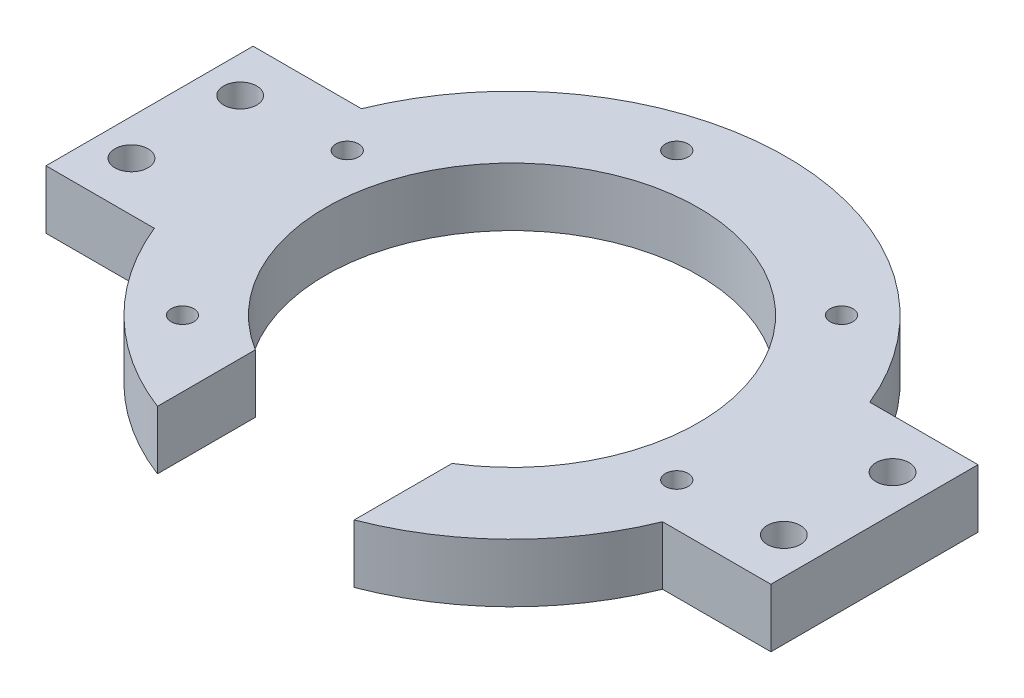
ISO-10303-21;
HEADER;
FILE_DESCRIPTION(('STEP AP214'),'2;1');
FILE_NAME('part.step','',(''),(''),'','','');
FILE_SCHEMA(('AUTOMOTIVE_DESIGN { 1 0 10303 214 1 1 1 1 }'));
ENDSEC;
DATA;
#1=APPLICATION_CONTEXT('core data for automotive mechanical design processes');
#2=APPLICATION_PROTOCOL_DEFINITION('international standard','automotive_design',2000,#1);
#3=PRODUCT_CONTEXT('',#1,'mechanical');
#4=PRODUCT('Part','Part','',(#3));
#5=PRODUCT_RELATED_PRODUCT_CATEGORY('part','',(#4));
#6=PRODUCT_DEFINITION_FORMATION('','',#4);
#7=PRODUCT_DEFINITION_CONTEXT('part definition',#1,'design');
#8=PRODUCT_DEFINITION('design','',#6,#7);
#9=PRODUCT_DEFINITION_SHAPE('','',#8);
#10=(LENGTH_UNIT() NAMED_UNIT(*) SI_UNIT(.MILLI.,.METRE.));
#11=(NAMED_UNIT(*) PLANE_ANGLE_UNIT() SI_UNIT($,.RADIAN.));
#12=(NAMED_UNIT(*) SI_UNIT($,.STERADIAN.) SOLID_ANGLE_UNIT());
#13=UNCERTAINTY_MEASURE_WITH_UNIT(LENGTH_MEASURE(1.E-05),#10,'distance_accuracy_value','');
#14=(GEOMETRIC_REPRESENTATION_CONTEXT(3) GLOBAL_UNCERTAINTY_ASSIGNED_CONTEXT((#13)) GLOBAL_UNIT_ASSIGNED_CONTEXT((#10,
#11,#12)) REPRESENTATION_CONTEXT('',''));
#15=CARTESIAN_POINT('',(0.,0.,0.));
#16=DIRECTION('',(0.,0.,1.));
#17=DIRECTION('',(1.,0.,0.));
#18=AXIS2_PLACEMENT_3D('',#15,#16,#17);
#19=CARTESIAN_POINT('',(0.,28.5928367151704,0.));
#20=DIRECTION('',(0.,1.,0.));
#21=DIRECTION('',(0.,0.,1.));
#22=AXIS2_PLACEMENT_3D('',#19,#20,#21);
#23=CYLINDRICAL_SURFACE('',#22,53.);
#24=CARTESIAN_POINT('',(0.,11.3,0.));
#25=DIRECTION('',(0.,1.,0.));
#26=DIRECTION('',(0.,0.,1.));
#27=AXIS2_PLACEMENT_3D('',#24,#25,#26);
#28=CIRCLE('',#27,53.);
#29=CARTESIAN_POINT('',(-49.0815647672321,11.3,20.));
#30=VERTEX_POINT('',#29);
#31=CARTESIAN_POINT('',(-19.,11.3,49.4772675074119));
#32=VERTEX_POINT('',#31);
#33=EDGE_CURVE('E67',#30,#32,#28,.T.);
#34=ORIENTED_EDGE('',*,*,#33,.F.);
#35=DIRECTION('',(0.,1.,0.));
#36=VECTOR('',#35,1.);
#37=CARTESIAN_POINT('',(-49.0815647672321,28.5928367151704,20.));
#38=LINE('',#37,#36);
#39=CARTESIAN_POINT('',(-49.0815647672321,0.,20.));
#40=VERTEX_POINT('',#39);
#41=EDGE_CURVE('E141',#30,#40,#38,.F.);
#42=ORIENTED_EDGE('',*,*,#41,.T.);
#43=CARTESIAN_POINT('',(0.,0.,0.));
#44=DIRECTION('',(0.,1.,0.));
#45=DIRECTION('',(0.,0.,1.));
#46=AXIS2_PLACEMENT_3D('',#43,#44,#45);
#47=CIRCLE('',#46,53.);
#48=CARTESIAN_POINT('',(-19.,0.,49.4772675074119));
#49=VERTEX_POINT('',#48);
#50=EDGE_CURVE('E293',#40,#49,#47,.T.);
#51=ORIENTED_EDGE('',*,*,#50,.T.);
#52=DIRECTION('',(0.,1.,0.));
#53=VECTOR('',#52,1.);
#54=CARTESIAN_POINT('',(-19.,28.5928367151704,49.4772675074119));
#55=LINE('',#54,#53);
#56=EDGE_CURVE('E278',#49,#32,#55,.T.);
#57=ORIENTED_EDGE('',*,*,#56,.T.);
#58=EDGE_LOOP('',(#34,#42,#51,#57));
#59=FACE_BOUND('',#58,.T.);
#60=ADVANCED_FACE('F43',(#59),#23,.T.);
#61=DIRECTION('',(0.,1.,0.));
#62=VECTOR('',#61,1.);
#63=CARTESIAN_POINT('',(49.0815647672321,28.5928367151704,20.));
#64=LINE('',#63,#62);
#65=CARTESIAN_POINT('',(49.0815647672321,11.3,20.));
#66=VERTEX_POINT('',#65);
#67=CARTESIAN_POINT('',(49.0815647672321,0.,20.));
#68=VERTEX_POINT('',#67);
#69=EDGE_CURVE('E216',#66,#68,#64,.F.);
#70=ORIENTED_EDGE('',*,*,#69,.F.);
#71=CARTESIAN_POINT('',(19.,11.3,49.4772675074119));
#72=VERTEX_POINT('',#71);
#73=EDGE_CURVE('E289',#72,#66,#28,.T.);
#74=ORIENTED_EDGE('',*,*,#73,.F.);
#75=DIRECTION('',(0.,1.,0.));
#76=VECTOR('',#75,1.);
#77=CARTESIAN_POINT('',(19.,28.5928367151704,49.4772675074119));
#78=LINE('',#77,#76);
#79=CARTESIAN_POINT('',(19.,0.,49.4772675074119));
#80=VERTEX_POINT('',#79);
#81=EDGE_CURVE('E264',#72,#80,#78,.F.);
#82=ORIENTED_EDGE('',*,*,#81,.T.);
#83=EDGE_CURVE('E295',#80,#68,#47,.T.);
#84=ORIENTED_EDGE('',*,*,#83,.T.);
#85=EDGE_LOOP('',(#70,#74,#82,#84));
#86=FACE_BOUND('',#85,.T.);
#87=ADVANCED_FACE('F379',(#86),#23,.T.);
#88=CARTESIAN_POINT('',(49.0815647672321,0.,-20.));
#89=VERTEX_POINT('',#88);
#90=CARTESIAN_POINT('',(-49.0815647672321,0.,-20.));
#91=VERTEX_POINT('',#90);
#92=EDGE_CURVE('E59',#89,#91,#47,.T.);
#93=ORIENTED_EDGE('',*,*,#92,.T.);
#94=DIRECTION('',(0.,1.,0.));
#95=VECTOR('',#94,1.);
#96=CARTESIAN_POINT('',(-49.0815647672321,28.5928367151704,-20.));
#97=LINE('',#96,#95);
#98=CARTESIAN_POINT('',(-49.0815647672321,11.3,-20.));
#99=VERTEX_POINT('',#98);
#100=EDGE_CURVE('E145',#91,#99,#97,.T.);
#101=ORIENTED_EDGE('',*,*,#100,.T.);
#102=CARTESIAN_POINT('',(49.0815647672321,11.3,-20.));
#103=VERTEX_POINT('',#102);
#104=EDGE_CURVE('E294',#103,#99,#28,.T.);
#105=ORIENTED_EDGE('',*,*,#104,.F.);
#106=DIRECTION('',(0.,1.,0.));
#107=VECTOR('',#106,1.);
#108=CARTESIAN_POINT('',(49.0815647672321,28.5928367151704,-20.));
#109=LINE('',#108,#107);
#110=EDGE_CURVE('E212',#89,#103,#109,.T.);
#111=ORIENTED_EDGE('',*,*,#110,.F.);
#112=EDGE_LOOP('',(#93,#101,#105,#111));
#113=FACE_BOUND('',#112,.T.);
#114=ADVANCED_FACE('F392',(#113),#23,.T.);
#115=CARTESIAN_POINT('',(0.,0.,0.));
#116=DIRECTION('',(0.,1.,0.));
#117=DIRECTION('',(0.,0.,1.));
#118=AXIS2_PLACEMENT_3D('',#115,#116,#117);
#119=PLANE('',#118);
#120=CARTESIAN_POINT('',(-63.,0.,10.5));
#121=DIRECTION('',(0.,1.,0.));
#122=DIRECTION('',(0.,0.,-1.));
#123=AXIS2_PLACEMENT_3D('',#120,#121,#122);
#124=CIRCLE('',#123,3.2);
#125=CARTESIAN_POINT('',(-63.,0.,7.3));
#126=VERTEX_POINT('',#125);
#127=EDGE_CURVE('E412',#126,#126,#124,.T.);
#128=ORIENTED_EDGE('',*,*,#127,.T.);
#129=EDGE_LOOP('',(#128));
#130=FACE_BOUND('',#129,.T.);
#131=CARTESIAN_POINT('',(-63.,0.,-10.5));
#132=DIRECTION('',(0.,-1.,0.));
#133=DIRECTION('',(0.,0.,1.));
#134=AXIS2_PLACEMENT_3D('',#131,#132,#133);
#135=CIRCLE('',#134,3.2);
#136=CARTESIAN_POINT('',(-63.,0.,-7.3));
#137=VERTEX_POINT('',#136);
#138=EDGE_CURVE('E416',#137,#137,#135,.T.);
#139=ORIENTED_EDGE('',*,*,#138,.F.);
#140=EDGE_LOOP('',(#139));
#141=FACE_BOUND('',#140,.T.);
#142=CARTESIAN_POINT('',(63.,0.,10.5));
#143=DIRECTION('',(0.,-1.,0.));
#144=DIRECTION('',(0.,0.,-1.));
#145=AXIS2_PLACEMENT_3D('',#142,#143,#144);
#146=CIRCLE('',#145,3.2);
#147=CARTESIAN_POINT('',(63.,0.,7.3));
#148=VERTEX_POINT('',#147);
#149=EDGE_CURVE('E420',#148,#148,#146,.T.);
#150=ORIENTED_EDGE('',*,*,#149,.F.);
#151=EDGE_LOOP('',(#150));
#152=FACE_BOUND('',#151,.T.);
#153=CARTESIAN_POINT('',(63.,0.,-10.5));
#154=DIRECTION('',(0.,1.,0.));
#155=DIRECTION('',(0.,0.,1.));
#156=AXIS2_PLACEMENT_3D('',#153,#154,#155);
#157=CIRCLE('',#156,3.2);
#158=CARTESIAN_POINT('',(63.,0.,-7.3));
#159=VERTEX_POINT('',#158);
#160=EDGE_CURVE('E157',#159,#159,#157,.T.);
#161=ORIENTED_EDGE('',*,*,#160,.T.);
#162=EDGE_LOOP('',(#161));
#163=FACE_BOUND('',#162,.T.);
#164=ORIENTED_EDGE('',*,*,#50,.F.);
#165=DIRECTION('',(1.,0.,0.));
#166=VECTOR('',#165,1.);
#167=CARTESIAN_POINT('',(-70.,0.,20.));
#168=LINE('',#167,#166);
#169=CARTESIAN_POINT('',(-70.,0.,20.));
#170=VERTEX_POINT('',#169);
#171=EDGE_CURVE('E173',#170,#40,#168,.T.);
#172=ORIENTED_EDGE('',*,*,#171,.F.);
#173=DIRECTION('',(0.,0.,-1.));
#174=VECTOR('',#173,1.);
#175=CARTESIAN_POINT('',(-70.,0.,20.));
#176=LINE('',#175,#174);
#177=CARTESIAN_POINT('',(-70.,0.,-20.));
#178=VERTEX_POINT('',#177);
#179=EDGE_CURVE('E155',#170,#178,#176,.T.);
#180=ORIENTED_EDGE('',*,*,#179,.T.);
#181=DIRECTION('',(1.,0.,0.));
#182=VECTOR('',#181,1.);
#183=CARTESIAN_POINT('',(-70.,0.,-20.));
#184=LINE('',#183,#182);
#185=EDGE_CURVE('E176',#178,#91,#184,.T.);
#186=ORIENTED_EDGE('',*,*,#185,.T.);
#187=ORIENTED_EDGE('',*,*,#92,.F.);
#188=DIRECTION('',(-1.,0.,0.));
#189=VECTOR('',#188,1.);
#190=CARTESIAN_POINT('',(70.,0.,-20.));
#191=LINE('',#190,#189);
#192=CARTESIAN_POINT('',(70.,0.,-20.));
#193=VERTEX_POINT('',#192);
#194=EDGE_CURVE('E205',#193,#89,#191,.T.);
#195=ORIENTED_EDGE('',*,*,#194,.F.);
#196=DIRECTION('',(0.,0.,-1.));
#197=VECTOR('',#196,1.);
#198=CARTESIAN_POINT('',(70.,0.,20.));
#199=LINE('',#198,#197);
#200=CARTESIAN_POINT('',(70.,0.,20.));
#201=VERTEX_POINT('',#200);
#202=EDGE_CURVE('E190',#201,#193,#199,.T.);
#203=ORIENTED_EDGE('',*,*,#202,.F.);
#204=DIRECTION('',(-1.,0.,0.));
#205=VECTOR('',#204,1.);
#206=CARTESIAN_POINT('',(70.,0.,20.));
#207=LINE('',#206,#205);
#208=EDGE_CURVE('E208',#201,#68,#207,.T.);
#209=ORIENTED_EDGE('',*,*,#208,.T.);
#210=ORIENTED_EDGE('',*,*,#83,.F.);
#211=DIRECTION('',(0.,0.,1.));
#212=VECTOR('',#211,1.);
#213=CARTESIAN_POINT('',(19.,0.,11.7));
#214=LINE('',#213,#212);
#215=CARTESIAN_POINT('',(19.,0.,30.5777697028413));
#216=VERTEX_POINT('',#215);
#217=EDGE_CURVE('E269',#216,#80,#214,.T.);
#218=ORIENTED_EDGE('',*,*,#217,.F.);
#219=CARTESIAN_POINT('',(0.,0.,0.));
#220=DIRECTION('',(0.,1.,0.));
#221=DIRECTION('',(0.,0.,1.));
#222=AXIS2_PLACEMENT_3D('',#219,#220,#221);
#223=CIRCLE('',#222,36.);
#224=CARTESIAN_POINT('',(-19.,0.,30.5777697028413));
#225=VERTEX_POINT('',#224);
#226=EDGE_CURVE('E282',#216,#225,#223,.T.);
#227=ORIENTED_EDGE('',*,*,#226,.T.);
#228=DIRECTION('',(0.,0.,1.));
#229=VECTOR('',#228,1.);
#230=CARTESIAN_POINT('',(-19.,0.,11.7));
#231=LINE('',#230,#229);
#232=EDGE_CURVE('E256',#225,#49,#231,.T.);
#233=ORIENTED_EDGE('',*,*,#232,.T.);
#234=EDGE_LOOP('',(#164,#172,#180,#186,#187,#195,#203,#209,#210,#218,#227,#233));
#235=FACE_BOUND('',#234,.T.);
#236=CARTESIAN_POINT('',(-11.6468570296132,0.,-43.4666621830081));
#237=DIRECTION('',(0.,1.,0.));
#238=DIRECTION('',(0.,0.,1.));
#239=AXIS2_PLACEMENT_3D('',#236,#237,#238);
#240=CIRCLE('',#239,2.2);
#241=CARTESIAN_POINT('',(-11.6468570296132,0.,-41.2666621830081));
#242=VERTEX_POINT('',#241);
#243=EDGE_CURVE('E224',#242,#242,#240,.T.);
#244=ORIENTED_EDGE('',*,*,#243,.T.);
#245=EDGE_LOOP('',(#244));
#246=FACE_BOUND('',#245,.T.);
#247=CARTESIAN_POINT('',(-31.8198051533951,0.,31.8198051533941));
#248=DIRECTION('',(0.,1.,0.));
#249=DIRECTION('',(0.866025403784443,0.,-0.499999999999992));
#250=AXIS2_PLACEMENT_3D('',#247,#248,#249);
#251=CIRCLE('',#250,2.2);
#252=CARTESIAN_POINT('',(-29.9145492650693,0.,30.7198051533941));
#253=VERTEX_POINT('',#252);
#254=EDGE_CURVE('E245',#253,#253,#251,.T.);
#255=ORIENTED_EDGE('',*,*,#254,.T.);
#256=EDGE_LOOP('',(#255));
#257=FACE_BOUND('',#256,.T.);
#258=CARTESIAN_POINT('',(31.8198051533951,0.,-31.8198051533941));
#259=DIRECTION('',(0.,1.,0.));
#260=DIRECTION('',(0.866025403784443,0.,-0.499999999999992));
#261=AXIS2_PLACEMENT_3D('',#258,#259,#260);
#262=CIRCLE('',#261,2.2);
#263=CARTESIAN_POINT('',(33.7250610417209,0.,-32.9198051533941));
#264=VERTEX_POINT('',#263);
#265=EDGE_CURVE('E237',#264,#264,#262,.T.);
#266=ORIENTED_EDGE('',*,*,#265,.T.);
#267=EDGE_LOOP('',(#266));
#268=FACE_BOUND('',#267,.T.);
#269=CARTESIAN_POINT('',(43.4666621830079,0.,11.6468570296139));
#270=DIRECTION('',(0.,1.,0.));
#271=DIRECTION('',(-0.866025403784436,0.,-0.500000000000004));
#272=AXIS2_PLACEMENT_3D('',#269,#270,#271);
#273=CIRCLE('',#272,2.2);
#274=CARTESIAN_POINT('',(41.5614062946822,0.,10.5468570296139));
#275=VERTEX_POINT('',#274);
#276=EDGE_CURVE('E229',#275,#275,#273,.T.);
#277=ORIENTED_EDGE('',*,*,#276,.T.);
#278=EDGE_LOOP('',(#277));
#279=FACE_BOUND('',#278,.T.);
#280=CARTESIAN_POINT('',(-43.4666621830079,0.,-11.6468570296139));
#281=DIRECTION('',(0.,1.,0.));
#282=DIRECTION('',(-0.866025403784436,0.,-0.500000000000004));
#283=AXIS2_PLACEMENT_3D('',#280,#281,#282);
#284=CIRCLE('',#283,2.2);
#285=CARTESIAN_POINT('',(-45.3719180713337,0.,-12.7468570296139));
#286=VERTEX_POINT('',#285);
#287=EDGE_CURVE('E220',#286,#286,#284,.T.);
#288=ORIENTED_EDGE('',*,*,#287,.T.);
#289=EDGE_LOOP('',(#288));
#290=FACE_BOUND('',#289,.T.);
#291=ADVANCED_FACE('F45',(#130,#141,#152,#163,#235,#246,#257,#268,#279,#290),#119,.F.);
#292=CARTESIAN_POINT('',(0.,11.3,-53.));
#293=DIRECTION('',(0.,-1.,0.));
#294=DIRECTION('',(0.,0.,-1.));
#295=AXIS2_PLACEMENT_3D('',#292,#293,#294);
#296=PLANE('',#295);
#297=CARTESIAN_POINT('',(-63.,11.3,10.5));
#298=DIRECTION('',(0.,1.,0.));
#299=DIRECTION('',(0.,0.,-1.));
#300=AXIS2_PLACEMENT_3D('',#297,#298,#299);
#301=CIRCLE('',#300,3.2);
#302=CARTESIAN_POINT('',(-63.,11.3,7.3));
#303=VERTEX_POINT('',#302);
#304=EDGE_CURVE('E443',#303,#303,#301,.T.);
#305=ORIENTED_EDGE('',*,*,#304,.F.);
#306=EDGE_LOOP('',(#305));
#307=FACE_BOUND('',#306,.T.);
#308=CARTESIAN_POINT('',(-63.,11.3,-10.5));
#309=DIRECTION('',(0.,-1.,0.));
#310=DIRECTION('',(0.,0.,1.));
#311=AXIS2_PLACEMENT_3D('',#308,#309,#310);
#312=CIRCLE('',#311,3.2);
#313=CARTESIAN_POINT('',(-63.,11.3,-7.3));
#314=VERTEX_POINT('',#313);
#315=EDGE_CURVE('E437',#314,#314,#312,.T.);
#316=ORIENTED_EDGE('',*,*,#315,.T.);
#317=EDGE_LOOP('',(#316));
#318=FACE_BOUND('',#317,.T.);
#319=CARTESIAN_POINT('',(63.,11.3,10.5));
#320=DIRECTION('',(0.,-1.,0.));
#321=DIRECTION('',(0.,0.,-1.));
#322=AXIS2_PLACEMENT_3D('',#319,#320,#321);
#323=CIRCLE('',#322,3.2);
#324=CARTESIAN_POINT('',(63.,11.3,7.3));
#325=VERTEX_POINT('',#324);
#326=EDGE_CURVE('E431',#325,#325,#323,.T.);
#327=ORIENTED_EDGE('',*,*,#326,.T.);
#328=EDGE_LOOP('',(#327));
#329=FACE_BOUND('',#328,.T.);
#330=CARTESIAN_POINT('',(63.,11.3,-10.5));
#331=DIRECTION('',(0.,1.,0.));
#332=DIRECTION('',(0.,0.,1.));
#333=AXIS2_PLACEMENT_3D('',#330,#331,#332);
#334=CIRCLE('',#333,3.2);
#335=CARTESIAN_POINT('',(63.,11.3,-7.3));
#336=VERTEX_POINT('',#335);
#337=EDGE_CURVE('E425',#336,#336,#334,.T.);
#338=ORIENTED_EDGE('',*,*,#337,.F.);
#339=EDGE_LOOP('',(#338));
#340=FACE_BOUND('',#339,.T.);
#341=ORIENTED_EDGE('',*,*,#104,.T.);
#342=DIRECTION('',(1.,0.,0.));
#343=VECTOR('',#342,1.);
#344=CARTESIAN_POINT('',(-70.,11.3,-20.));
#345=LINE('',#344,#343);
#346=CARTESIAN_POINT('',(-70.,11.3,-20.));
#347=VERTEX_POINT('',#346);
#348=EDGE_CURVE('E146',#347,#99,#345,.T.);
#349=ORIENTED_EDGE('',*,*,#348,.F.);
#350=DIRECTION('',(0.,0.,1.));
#351=VECTOR('',#350,1.);
#352=CARTESIAN_POINT('',(-70.,11.3,20.));
#353=LINE('',#352,#351);
#354=CARTESIAN_POINT('',(-70.,11.3,20.));
#355=VERTEX_POINT('',#354);
#356=EDGE_CURVE('E152',#347,#355,#353,.T.);
#357=ORIENTED_EDGE('',*,*,#356,.T.);
#358=DIRECTION('',(1.,0.,0.));
#359=VECTOR('',#358,1.);
#360=CARTESIAN_POINT('',(-70.,11.3,20.));
#361=LINE('',#360,#359);
#362=EDGE_CURVE('E135',#355,#30,#361,.T.);
#363=ORIENTED_EDGE('',*,*,#362,.T.);
#364=ORIENTED_EDGE('',*,*,#33,.T.);
#365=DIRECTION('',(0.,0.,1.));
#366=VECTOR('',#365,1.);
#367=CARTESIAN_POINT('',(-19.,11.3,11.7));
#368=LINE('',#367,#366);
#369=CARTESIAN_POINT('',(-19.,11.3,30.5777697028413));
#370=VERTEX_POINT('',#369);
#371=EDGE_CURVE('E260',#370,#32,#368,.T.);
#372=ORIENTED_EDGE('',*,*,#371,.F.);
#373=CARTESIAN_POINT('',(0.,11.3,0.));
#374=DIRECTION('',(0.,1.,0.));
#375=DIRECTION('',(0.,0.,1.));
#376=AXIS2_PLACEMENT_3D('',#373,#374,#375);
#377=CIRCLE('',#376,36.);
#378=CARTESIAN_POINT('',(19.,11.3,30.5777697028413));
#379=VERTEX_POINT('',#378);
#380=EDGE_CURVE('E281',#379,#370,#377,.T.);
#381=ORIENTED_EDGE('',*,*,#380,.F.);
#382=DIRECTION('',(0.,0.,1.));
#383=VECTOR('',#382,1.);
#384=CARTESIAN_POINT('',(19.,11.3,11.7));
#385=LINE('',#384,#383);
#386=EDGE_CURVE('E265',#379,#72,#385,.T.);
#387=ORIENTED_EDGE('',*,*,#386,.T.);
#388=ORIENTED_EDGE('',*,*,#73,.T.);
#389=DIRECTION('',(-1.,0.,0.));
#390=VECTOR('',#389,1.);
#391=CARTESIAN_POINT('',(70.,11.3,20.));
#392=LINE('',#391,#390);
#393=CARTESIAN_POINT('',(70.,11.3,20.));
#394=VERTEX_POINT('',#393);
#395=EDGE_CURVE('E199',#394,#66,#392,.T.);
#396=ORIENTED_EDGE('',*,*,#395,.F.);
#397=DIRECTION('',(0.,0.,1.));
#398=VECTOR('',#397,1.);
#399=CARTESIAN_POINT('',(70.,11.3,20.));
#400=LINE('',#399,#398);
#401=CARTESIAN_POINT('',(70.,11.3,-20.));
#402=VERTEX_POINT('',#401);
#403=EDGE_CURVE('E196',#402,#394,#400,.T.);
#404=ORIENTED_EDGE('',*,*,#403,.F.);
#405=DIRECTION('',(-1.,0.,0.));
#406=VECTOR('',#405,1.);
#407=CARTESIAN_POINT('',(70.,11.3,-20.));
#408=LINE('',#407,#406);
#409=EDGE_CURVE('E202',#402,#103,#408,.T.);
#410=ORIENTED_EDGE('',*,*,#409,.T.);
#411=EDGE_LOOP('',(#341,#349,#357,#363,#364,#372,#381,#387,#388,#396,#404,#410));
#412=FACE_BOUND('',#411,.T.);
#413=CARTESIAN_POINT('',(-11.6468570296132,11.3,-43.4666621830081));
#414=DIRECTION('',(0.,1.,0.));
#415=DIRECTION('',(0.,0.,1.));
#416=AXIS2_PLACEMENT_3D('',#413,#414,#415);
#417=CIRCLE('',#416,2.2);
#418=CARTESIAN_POINT('',(-11.6468570296132,11.3,-41.2666621830081));
#419=VERTEX_POINT('',#418);
#420=EDGE_CURVE('E252',#419,#419,#417,.T.);
#421=ORIENTED_EDGE('',*,*,#420,.F.);
#422=EDGE_LOOP('',(#421));
#423=FACE_BOUND('',#422,.T.);
#424=CARTESIAN_POINT('',(-31.8198051533951,11.3,31.8198051533941));
#425=DIRECTION('',(0.,1.,0.));
#426=DIRECTION('',(0.866025403784443,0.,-0.499999999999992));
#427=AXIS2_PLACEMENT_3D('',#424,#425,#426);
#428=CIRCLE('',#427,2.2);
#429=CARTESIAN_POINT('',(-29.9145492650693,11.3,30.7198051533941));
#430=VERTEX_POINT('',#429);
#431=EDGE_CURVE('E219',#430,#430,#428,.T.);
#432=ORIENTED_EDGE('',*,*,#431,.F.);
#433=EDGE_LOOP('',(#432));
#434=FACE_BOUND('',#433,.T.);
#435=CARTESIAN_POINT('',(31.8198051533951,11.3,-31.8198051533941));
#436=DIRECTION('',(0.,1.,0.));
#437=DIRECTION('',(0.866025403784443,0.,-0.499999999999992));
#438=AXIS2_PLACEMENT_3D('',#435,#436,#437);
#439=CIRCLE('',#438,2.2);
#440=CARTESIAN_POINT('',(33.7250610417209,11.3,-32.9198051533941));
#441=VERTEX_POINT('',#440);
#442=EDGE_CURVE('E241',#441,#441,#439,.T.);
#443=ORIENTED_EDGE('',*,*,#442,.F.);
#444=EDGE_LOOP('',(#443));
#445=FACE_BOUND('',#444,.T.);
#446=CARTESIAN_POINT('',(43.4666621830079,11.3,11.6468570296139));
#447=DIRECTION('',(0.,1.,0.));
#448=DIRECTION('',(-0.866025403784436,0.,-0.500000000000004));
#449=AXIS2_PLACEMENT_3D('',#446,#447,#448);
#450=CIRCLE('',#449,2.2);
#451=CARTESIAN_POINT('',(41.5614062946822,11.3,10.5468570296139));
#452=VERTEX_POINT('',#451);
#453=EDGE_CURVE('E233',#452,#452,#450,.T.);
#454=ORIENTED_EDGE('',*,*,#453,.F.);
#455=EDGE_LOOP('',(#454));
#456=FACE_BOUND('',#455,.T.);
#457=CARTESIAN_POINT('',(-43.4666621830079,11.3,-11.6468570296139));
#458=DIRECTION('',(0.,1.,0.));
#459=DIRECTION('',(-0.866025403784436,0.,-0.500000000000004));
#460=AXIS2_PLACEMENT_3D('',#457,#458,#459);
#461=CIRCLE('',#460,2.2);
#462=CARTESIAN_POINT('',(-45.3719180713337,11.3,-12.7468570296139));
#463=VERTEX_POINT('',#462);
#464=EDGE_CURVE('E225',#463,#463,#461,.T.);
#465=ORIENTED_EDGE('',*,*,#464,.F.);
#466=EDGE_LOOP('',(#465));
#467=FACE_BOUND('',#466,.T.);
#468=ADVANCED_FACE('F160',(#307,#318,#329,#340,#412,#423,#434,#445,#456,#467),#296,.F.);
#469=CARTESIAN_POINT('',(0.,0.,0.));
#470=DIRECTION('',(0.,1.,0.));
#471=DIRECTION('',(0.,0.,1.));
#472=AXIS2_PLACEMENT_3D('',#469,#470,#471);
#473=CYLINDRICAL_SURFACE('',#472,36.);
#474=ORIENTED_EDGE('',*,*,#380,.T.);
#475=DIRECTION('',(0.,1.,0.));
#476=VECTOR('',#475,1.);
#477=CARTESIAN_POINT('',(-19.,0.,30.5777697028413));
#478=LINE('',#477,#476);
#479=EDGE_CURVE('E11',#370,#225,#478,.F.);
#480=ORIENTED_EDGE('',*,*,#479,.T.);
#481=ORIENTED_EDGE('',*,*,#226,.F.);
#482=DIRECTION('',(0.,1.,0.));
#483=VECTOR('',#482,1.);
#484=CARTESIAN_POINT('',(19.,0.,30.5777697028413));
#485=LINE('',#484,#483);
#486=EDGE_CURVE('E52',#216,#379,#485,.T.);
#487=ORIENTED_EDGE('',*,*,#486,.T.);
#488=EDGE_LOOP('',(#474,#480,#481,#487));
#489=FACE_BOUND('',#488,.T.);
#490=ADVANCED_FACE('F304',(#489),#473,.F.);
#491=CARTESIAN_POINT('',(19.,11.3,11.7));
#492=DIRECTION('',(1.,0.,0.));
#493=DIRECTION('',(0.,1.,0.));
#494=AXIS2_PLACEMENT_3D('',#491,#492,#493);
#495=PLANE('',#494);
#496=ORIENTED_EDGE('',*,*,#386,.F.);
#497=ORIENTED_EDGE('',*,*,#486,.F.);
#498=ORIENTED_EDGE('',*,*,#217,.T.);
#499=ORIENTED_EDGE('',*,*,#81,.F.);
#500=EDGE_LOOP('',(#496,#497,#498,#499));
#501=FACE_BOUND('',#500,.T.);
#502=ADVANCED_FACE('F380',(#501),#495,.F.);
#503=CARTESIAN_POINT('',(-19.,11.3,11.7));
#504=DIRECTION('',(-1.,0.,0.));
#505=DIRECTION('',(0.,-1.,0.));
#506=AXIS2_PLACEMENT_3D('',#503,#504,#505);
#507=PLANE('',#506);
#508=ORIENTED_EDGE('',*,*,#232,.F.);
#509=ORIENTED_EDGE('',*,*,#479,.F.);
#510=ORIENTED_EDGE('',*,*,#371,.T.);
#511=ORIENTED_EDGE('',*,*,#56,.F.);
#512=EDGE_LOOP('',(#508,#509,#510,#511));
#513=FACE_BOUND('',#512,.T.);
#514=ADVANCED_FACE('F311',(#513),#507,.F.);
#515=CARTESIAN_POINT('',(-11.6468570296132,0.,-43.4666621830081));
#516=DIRECTION('',(0.,1.,0.));
#517=DIRECTION('',(0.,0.,1.));
#518=AXIS2_PLACEMENT_3D('',#515,#516,#517);
#519=CYLINDRICAL_SURFACE('',#518,2.2);
#520=ORIENTED_EDGE('',*,*,#243,.F.);
#521=EDGE_LOOP('',(#520));
#522=FACE_BOUND('',#521,.T.);
#523=ORIENTED_EDGE('',*,*,#420,.T.);
#524=EDGE_LOOP('',(#523));
#525=FACE_BOUND('',#524,.T.);
#526=ADVANCED_FACE('F387',(#522,#525),#519,.F.);
#527=CARTESIAN_POINT('',(-31.8198051533951,0.,31.8198051533941));
#528=DIRECTION('',(0.,1.,0.));
#529=DIRECTION('',(0.,0.,1.));
#530=AXIS2_PLACEMENT_3D('',#527,#528,#529);
#531=CYLINDRICAL_SURFACE('',#530,2.2);
#532=ORIENTED_EDGE('',*,*,#254,.F.);
#533=EDGE_LOOP('',(#532));
#534=FACE_BOUND('',#533,.T.);
#535=ORIENTED_EDGE('',*,*,#431,.T.);
#536=EDGE_LOOP('',(#535));
#537=FACE_BOUND('',#536,.T.);
#538=ADVANCED_FACE('F497',(#534,#537),#531,.F.);
#539=CARTESIAN_POINT('',(31.8198051533951,0.,-31.8198051533941));
#540=DIRECTION('',(0.,1.,0.));
#541=DIRECTION('',(0.,0.,1.));
#542=AXIS2_PLACEMENT_3D('',#539,#540,#541);
#543=CYLINDRICAL_SURFACE('',#542,2.2);
#544=ORIENTED_EDGE('',*,*,#265,.F.);
#545=EDGE_LOOP('',(#544));
#546=FACE_BOUND('',#545,.T.);
#547=ORIENTED_EDGE('',*,*,#442,.T.);
#548=EDGE_LOOP('',(#547));
#549=FACE_BOUND('',#548,.T.);
#550=ADVANCED_FACE('F493',(#546,#549),#543,.F.);
#551=CARTESIAN_POINT('',(43.4666621830079,0.,11.6468570296139));
#552=DIRECTION('',(0.,1.,0.));
#553=DIRECTION('',(0.,0.,1.));
#554=AXIS2_PLACEMENT_3D('',#551,#552,#553);
#555=CYLINDRICAL_SURFACE('',#554,2.2);
#556=ORIENTED_EDGE('',*,*,#276,.F.);
#557=EDGE_LOOP('',(#556));
#558=FACE_BOUND('',#557,.T.);
#559=ORIENTED_EDGE('',*,*,#453,.T.);
#560=EDGE_LOOP('',(#559));
#561=FACE_BOUND('',#560,.T.);
#562=ADVANCED_FACE('F489',(#558,#561),#555,.F.);
#563=CARTESIAN_POINT('',(-43.4666621830079,0.,-11.6468570296139));
#564=DIRECTION('',(0.,1.,0.));
#565=DIRECTION('',(0.,0.,1.));
#566=AXIS2_PLACEMENT_3D('',#563,#564,#565);
#567=CYLINDRICAL_SURFACE('',#566,2.2);
#568=ORIENTED_EDGE('',*,*,#287,.F.);
#569=EDGE_LOOP('',(#568));
#570=FACE_BOUND('',#569,.T.);
#571=ORIENTED_EDGE('',*,*,#464,.T.);
#572=EDGE_LOOP('',(#571));
#573=FACE_BOUND('',#572,.T.);
#574=ADVANCED_FACE('F486',(#570,#573),#567,.F.);
#575=CARTESIAN_POINT('',(70.,0.,20.));
#576=DIRECTION('',(0.,0.,-1.));
#577=DIRECTION('',(-1.,0.,0.));
#578=AXIS2_PLACEMENT_3D('',#575,#576,#577);
#579=PLANE('',#578);
#580=ORIENTED_EDGE('',*,*,#395,.T.);
#581=ORIENTED_EDGE('',*,*,#69,.T.);
#582=ORIENTED_EDGE('',*,*,#208,.F.);
#583=DIRECTION('',(0.,-1.,0.));
#584=VECTOR('',#583,1.);
#585=CARTESIAN_POINT('',(70.,0.,20.));
#586=LINE('',#585,#584);
#587=EDGE_CURVE('E186',#394,#201,#586,.T.);
#588=ORIENTED_EDGE('',*,*,#587,.F.);
#589=EDGE_LOOP('',(#580,#581,#582,#588));
#590=FACE_BOUND('',#589,.T.);
#591=ADVANCED_FACE('F375',(#590),#579,.F.);
#592=CARTESIAN_POINT('',(70.,0.,-20.));
#593=DIRECTION('',(0.,0.,1.));
#594=DIRECTION('',(0.,-1.,0.));
#595=AXIS2_PLACEMENT_3D('',#592,#593,#594);
#596=PLANE('',#595);
#597=ORIENTED_EDGE('',*,*,#194,.T.);
#598=ORIENTED_EDGE('',*,*,#110,.T.);
#599=ORIENTED_EDGE('',*,*,#409,.F.);
#600=DIRECTION('',(0.,1.,0.));
#601=VECTOR('',#600,1.);
#602=CARTESIAN_POINT('',(70.,0.,-20.));
#603=LINE('',#602,#601);
#604=EDGE_CURVE('E193',#193,#402,#603,.T.);
#605=ORIENTED_EDGE('',*,*,#604,.F.);
#606=EDGE_LOOP('',(#597,#598,#599,#605));
#607=FACE_BOUND('',#606,.T.);
#608=ADVANCED_FACE('F368',(#607),#596,.F.);
#609=CARTESIAN_POINT('',(70.,0.,0.));
#610=DIRECTION('',(-1.,0.,0.));
#611=DIRECTION('',(0.,0.,1.));
#612=AXIS2_PLACEMENT_3D('',#609,#610,#611);
#613=PLANE('',#612);
#614=ORIENTED_EDGE('',*,*,#587,.T.);
#615=ORIENTED_EDGE('',*,*,#202,.T.);
#616=ORIENTED_EDGE('',*,*,#604,.T.);
#617=ORIENTED_EDGE('',*,*,#403,.T.);
#618=EDGE_LOOP('',(#614,#615,#616,#617));
#619=FACE_BOUND('',#618,.T.);
#620=ADVANCED_FACE('F370',(#619),#613,.F.);
#621=CARTESIAN_POINT('',(-70.,0.,20.));
#622=DIRECTION('',(0.,0.,1.));
#623=DIRECTION('',(1.,0.,0.));
#624=AXIS2_PLACEMENT_3D('',#621,#622,#623);
#625=PLANE('',#624);
#626=ORIENTED_EDGE('',*,*,#41,.F.);
#627=ORIENTED_EDGE('',*,*,#362,.F.);
#628=DIRECTION('',(0.,-1.,0.));
#629=VECTOR('',#628,1.);
#630=CARTESIAN_POINT('',(-70.,0.,20.));
#631=LINE('',#630,#629);
#632=EDGE_CURVE('E139',#355,#170,#631,.T.);
#633=ORIENTED_EDGE('',*,*,#632,.T.);
#634=ORIENTED_EDGE('',*,*,#171,.T.);
#635=EDGE_LOOP('',(#626,#627,#633,#634));
#636=FACE_BOUND('',#635,.T.);
#637=ADVANCED_FACE('F137',(#636),#625,.T.);
#638=CARTESIAN_POINT('',(-70.,0.,-20.));
#639=DIRECTION('',(0.,0.,-1.));
#640=DIRECTION('',(0.,1.,0.));
#641=AXIS2_PLACEMENT_3D('',#638,#639,#640);
#642=PLANE('',#641);
#643=ORIENTED_EDGE('',*,*,#100,.F.);
#644=ORIENTED_EDGE('',*,*,#185,.F.);
#645=DIRECTION('',(0.,1.,0.));
#646=VECTOR('',#645,1.);
#647=CARTESIAN_POINT('',(-70.,0.,-20.));
#648=LINE('',#647,#646);
#649=EDGE_CURVE('E164',#178,#347,#648,.T.);
#650=ORIENTED_EDGE('',*,*,#649,.T.);
#651=ORIENTED_EDGE('',*,*,#348,.T.);
#652=EDGE_LOOP('',(#643,#644,#650,#651));
#653=FACE_BOUND('',#652,.T.);
#654=ADVANCED_FACE('F363',(#653),#642,.T.);
#655=CARTESIAN_POINT('',(-70.,0.,0.));
#656=DIRECTION('',(1.,0.,0.));
#657=DIRECTION('',(0.,0.,1.));
#658=AXIS2_PLACEMENT_3D('',#655,#656,#657);
#659=PLANE('',#658);
#660=ORIENTED_EDGE('',*,*,#632,.F.);
#661=ORIENTED_EDGE('',*,*,#356,.F.);
#662=ORIENTED_EDGE('',*,*,#649,.F.);
#663=ORIENTED_EDGE('',*,*,#179,.F.);
#664=EDGE_LOOP('',(#660,#661,#662,#663));
#665=FACE_BOUND('',#664,.T.);
#666=ADVANCED_FACE('F150',(#665),#659,.F.);
#667=CARTESIAN_POINT('',(63.,0.,-10.5));
#668=DIRECTION('',(0.,1.,0.));
#669=DIRECTION('',(0.,0.,1.));
#670=AXIS2_PLACEMENT_3D('',#667,#668,#669);
#671=CYLINDRICAL_SURFACE('',#670,3.2);
#672=ORIENTED_EDGE('',*,*,#160,.F.);
#673=EDGE_LOOP('',(#672));
#674=FACE_BOUND('',#673,.T.);
#675=ORIENTED_EDGE('',*,*,#337,.T.);
#676=EDGE_LOOP('',(#675));
#677=FACE_BOUND('',#676,.T.);
#678=ADVANCED_FACE('F465',(#674,#677),#671,.F.);
#679=CARTESIAN_POINT('',(63.,0.,10.5));
#680=DIRECTION('',(0.,1.,0.));
#681=DIRECTION('',(0.,0.,1.));
#682=AXIS2_PLACEMENT_3D('',#679,#680,#681);
#683=CYLINDRICAL_SURFACE('',#682,3.2);
#684=ORIENTED_EDGE('',*,*,#149,.T.);
#685=EDGE_LOOP('',(#684));
#686=FACE_BOUND('',#685,.T.);
#687=ORIENTED_EDGE('',*,*,#326,.F.);
#688=EDGE_LOOP('',(#687));
#689=FACE_BOUND('',#688,.T.);
#690=ADVANCED_FACE('F466',(#686,#689),#683,.F.);
#691=CARTESIAN_POINT('',(-63.,0.,-10.5));
#692=DIRECTION('',(0.,1.,0.));
#693=DIRECTION('',(0.,0.,1.));
#694=AXIS2_PLACEMENT_3D('',#691,#692,#693);
#695=CYLINDRICAL_SURFACE('',#694,3.2);
#696=ORIENTED_EDGE('',*,*,#138,.T.);
#697=EDGE_LOOP('',(#696));
#698=FACE_BOUND('',#697,.T.);
#699=ORIENTED_EDGE('',*,*,#315,.F.);
#700=EDGE_LOOP('',(#699));
#701=FACE_BOUND('',#700,.T.);
#702=ADVANCED_FACE('F472',(#698,#701),#695,.F.);
#703=CARTESIAN_POINT('',(-63.,0.,10.5));
#704=DIRECTION('',(0.,1.,0.));
#705=DIRECTION('',(0.,0.,1.));
#706=AXIS2_PLACEMENT_3D('',#703,#704,#705);
#707=CYLINDRICAL_SURFACE('',#706,3.2);
#708=ORIENTED_EDGE('',*,*,#127,.F.);
#709=EDGE_LOOP('',(#708));
#710=FACE_BOUND('',#709,.T.);
#711=ORIENTED_EDGE('',*,*,#304,.T.);
#712=EDGE_LOOP('',(#711));
#713=FACE_BOUND('',#712,.T.);
#714=ADVANCED_FACE('F457',(#710,#713),#707,.F.);
#715=CLOSED_SHELL('',(#60,#87,#114,#291,#468,#490,#502,#514,#526,#538,#550,#562,#574,#591,#608,
#620,#637,#654,#666,#678,#690,#702,#714));
#716=MANIFOLD_SOLID_BREP('B2',#715);
#717=ADVANCED_BREP_SHAPE_REPRESENTATION('',(#18,#716),#14);
#718=SHAPE_DEFINITION_REPRESENTATION(#9,#717);
ENDSEC;
END-ISO-10303-21;
